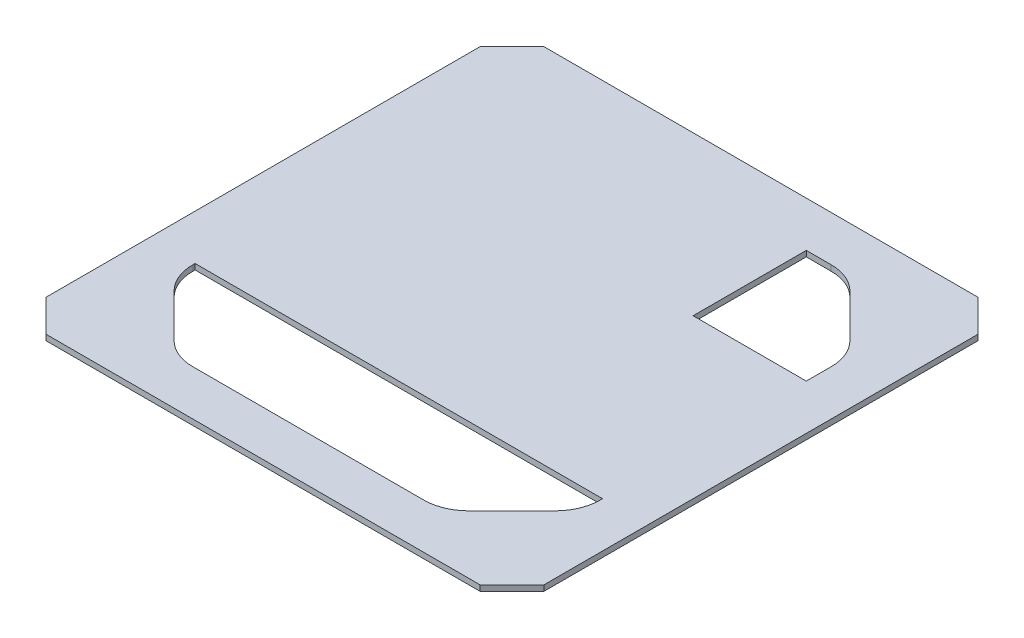
ISO-10303-21;
HEADER;
FILE_DESCRIPTION(('STEP AP214'),'2;1');
FILE_NAME('part.step','',(''),(''),'','','');
FILE_SCHEMA(('AUTOMOTIVE_DESIGN { 1 0 10303 214 1 1 1 1 }'));
ENDSEC;
DATA;
#1=APPLICATION_CONTEXT('core data for automotive mechanical design processes');
#2=APPLICATION_PROTOCOL_DEFINITION('international standard','automotive_design',2000,#1);
#3=PRODUCT_CONTEXT('',#1,'mechanical');
#4=PRODUCT('Part','Part','',(#3));
#5=PRODUCT_RELATED_PRODUCT_CATEGORY('part','',(#4));
#6=PRODUCT_DEFINITION_FORMATION('','',#4);
#7=PRODUCT_DEFINITION_CONTEXT('part definition',#1,'design');
#8=PRODUCT_DEFINITION('design','',#6,#7);
#9=PRODUCT_DEFINITION_SHAPE('','',#8);
#10=(LENGTH_UNIT() NAMED_UNIT(*) SI_UNIT(.MILLI.,.METRE.));
#11=(NAMED_UNIT(*) PLANE_ANGLE_UNIT() SI_UNIT($,.RADIAN.));
#12=(NAMED_UNIT(*) SI_UNIT($,.STERADIAN.) SOLID_ANGLE_UNIT());
#13=UNCERTAINTY_MEASURE_WITH_UNIT(LENGTH_MEASURE(1.E-05),#10,'distance_accuracy_value','');
#14=(GEOMETRIC_REPRESENTATION_CONTEXT(3) GLOBAL_UNCERTAINTY_ASSIGNED_CONTEXT((#13)) GLOBAL_UNIT_ASSIGNED_CONTEXT((#10,
#11,#12)) REPRESENTATION_CONTEXT('',''));
#15=CARTESIAN_POINT('',(0.,0.,0.));
#16=DIRECTION('',(0.,0.,1.));
#17=DIRECTION('',(1.,0.,0.));
#18=AXIS2_PLACEMENT_3D('',#15,#16,#17);
#19=CARTESIAN_POINT('',(114.3,0.,-27.0780936501646));
#20=DIRECTION('',(1.,0.,0.));
#21=DIRECTION('',(0.,0.,-1.));
#22=AXIS2_PLACEMENT_3D('',#19,#20,#21);
#23=PLANE('',#22);
#24=DIRECTION('',(0.,0.,-1.));
#25=VECTOR('',#24,1.);
#26=CARTESIAN_POINT('',(114.3,0.,-27.0780936501646));
#27=LINE('',#26,#25);
#28=CARTESIAN_POINT('',(114.3,0.,-2.58065486085614));
#29=VERTEX_POINT('',#28);
#30=CARTESIAN_POINT('',(114.3,0.,-16.557069165888));
#31=VERTEX_POINT('',#30);
#32=EDGE_CURVE('E242',#29,#31,#27,.T.);
#33=ORIENTED_EDGE('',*,*,#32,.F.);
#34=DIRECTION('',(0.,1.,0.));
#35=VECTOR('',#34,1.);
#36=CARTESIAN_POINT('',(114.3,0.,-2.58065486085614));
#37=LINE('',#36,#35);
#38=CARTESIAN_POINT('',(114.3,3.175,-2.58065486085614));
#39=VERTEX_POINT('',#38);
#40=EDGE_CURVE('E40',#29,#39,#37,.T.);
#41=ORIENTED_EDGE('',*,*,#40,.T.);
#42=DIRECTION('',(0.,0.,-1.));
#43=VECTOR('',#42,1.);
#44=CARTESIAN_POINT('',(114.3,3.175,-27.0780936501646));
#45=LINE('',#44,#43);
#46=CARTESIAN_POINT('',(114.3,3.175,-16.557069165888));
#47=VERTEX_POINT('',#46);
#48=EDGE_CURVE('E208',#39,#47,#45,.T.);
#49=ORIENTED_EDGE('',*,*,#48,.T.);
#50=DIRECTION('',(0.,1.,0.));
#51=VECTOR('',#50,1.);
#52=CARTESIAN_POINT('',(114.3,0.,-16.557069165888));
#53=LINE('',#52,#51);
#54=EDGE_CURVE('E323',#47,#31,#53,.F.);
#55=ORIENTED_EDGE('',*,*,#54,.T.);
#56=EDGE_LOOP('',(#33,#41,#49,#55));
#57=FACE_BOUND('',#56,.T.);
#58=ADVANCED_FACE('F32',(#57),#23,.F.);
#59=CARTESIAN_POINT('',(139.7,3.175,169.958832897006));
#60=DIRECTION('',(-0.707106781186548,0.,-0.707106781186547));
#61=DIRECTION('',(-0.707106781186547,0.,0.707106781186548));
#62=AXIS2_PLACEMENT_3D('',#59,#60,#61);
#63=PLANE('',#62);
#64=DIRECTION('',(0.707106781186547,0.,-0.707106781186548));
#65=VECTOR('',#64,1.);
#66=CARTESIAN_POINT('',(139.7,0.,169.958832897006));
#67=LINE('',#66,#65);
#68=CARTESIAN_POINT('',(121.739487757862,0.,187.919345139144));
#69=VERTEX_POINT('',#68);
#70=CARTESIAN_POINT('',(139.7,0.,169.958832897006));
#71=VERTEX_POINT('',#70);
#72=EDGE_CURVE('E248',#69,#71,#67,.T.);
#73=ORIENTED_EDGE('',*,*,#72,.T.);
#74=DIRECTION('',(0.,-1.,0.));
#75=VECTOR('',#74,1.);
#76=CARTESIAN_POINT('',(139.7,3.175,169.958832897006));
#77=LINE('',#76,#75);
#78=CARTESIAN_POINT('',(139.7,3.175,169.958832897006));
#79=VERTEX_POINT('',#78);
#80=EDGE_CURVE('E320',#79,#71,#77,.T.);
#81=ORIENTED_EDGE('',*,*,#80,.F.);
#82=DIRECTION('',(0.707106781186547,0.,-0.707106781186548));
#83=VECTOR('',#82,1.);
#84=CARTESIAN_POINT('',(139.7,3.175,169.958832897006));
#85=LINE('',#84,#83);
#86=CARTESIAN_POINT('',(121.739487757862,3.175,187.919345139144));
#87=VERTEX_POINT('',#86);
#88=EDGE_CURVE('E266',#87,#79,#85,.T.);
#89=ORIENTED_EDGE('',*,*,#88,.F.);
#90=DIRECTION('',(0.,-1.,0.));
#91=VECTOR('',#90,1.);
#92=CARTESIAN_POINT('',(121.739487757862,3.175,187.919345139144));
#93=LINE('',#92,#91);
#94=EDGE_CURVE('E284',#87,#69,#93,.T.);
#95=ORIENTED_EDGE('',*,*,#94,.T.);
#96=EDGE_LOOP('',(#73,#81,#89,#95));
#97=FACE_BOUND('',#96,.T.);
#98=ADVANCED_FACE('F461',(#97),#63,.F.);
#99=CARTESIAN_POINT('',(139.7,3.175,-73.5201426187178));
#100=DIRECTION('',(-1.,0.,0.));
#101=DIRECTION('',(0.,0.,1.));
#102=AXIS2_PLACEMENT_3D('',#99,#100,#101);
#103=PLANE('',#102);
#104=DIRECTION('',(0.,0.,-1.));
#105=VECTOR('',#104,1.);
#106=CARTESIAN_POINT('',(139.7,0.,-73.5201426187178));
#107=LINE('',#106,#105);
#108=CARTESIAN_POINT('',(139.7,0.,-73.5201426187178));
#109=VERTEX_POINT('',#108);
#110=EDGE_CURVE('E287',#71,#109,#107,.T.);
#111=ORIENTED_EDGE('',*,*,#110,.T.);
#112=DIRECTION('',(0.,-1.,0.));
#113=VECTOR('',#112,1.);
#114=CARTESIAN_POINT('',(139.7,3.175,-73.5201426187178));
#115=LINE('',#114,#113);
#116=CARTESIAN_POINT('',(139.7,3.175,-73.5201426187178));
#117=VERTEX_POINT('',#116);
#118=EDGE_CURVE('E317',#117,#109,#115,.T.);
#119=ORIENTED_EDGE('',*,*,#118,.F.);
#120=DIRECTION('',(0.,0.,-1.));
#121=VECTOR('',#120,1.);
#122=CARTESIAN_POINT('',(139.7,3.175,-73.5201426187178));
#123=LINE('',#122,#121);
#124=EDGE_CURVE('E269',#79,#117,#123,.T.);
#125=ORIENTED_EDGE('',*,*,#124,.F.);
#126=ORIENTED_EDGE('',*,*,#80,.T.);
#127=EDGE_LOOP('',(#111,#119,#125,#126));
#128=FACE_BOUND('',#127,.T.);
#129=ADVANCED_FACE('F466',(#128),#103,.F.);
#130=CARTESIAN_POINT('',(139.7,3.175,-73.5201426187178));
#131=DIRECTION('',(-0.707106781186548,0.,0.707106781186547));
#132=DIRECTION('',(0.707106781186547,0.,0.707106781186548));
#133=AXIS2_PLACEMENT_3D('',#130,#131,#132);
#134=PLANE('',#133);
#135=DIRECTION('',(-0.707106781186547,0.,-0.707106781186548));
#136=VECTOR('',#135,1.);
#137=CARTESIAN_POINT('',(139.7,0.,-73.5201426187178));
#138=LINE('',#137,#136);
#139=CARTESIAN_POINT('',(121.739487757862,0.,-91.4806548608561));
#140=VERTEX_POINT('',#139);
#141=EDGE_CURVE('E289',#109,#140,#138,.T.);
#142=ORIENTED_EDGE('',*,*,#141,.T.);
#143=DIRECTION('',(0.,-1.,0.));
#144=VECTOR('',#143,1.);
#145=CARTESIAN_POINT('',(121.739487757862,3.175,-91.4806548608561));
#146=LINE('',#145,#144);
#147=CARTESIAN_POINT('',(121.739487757862,3.175,-91.4806548608561));
#148=VERTEX_POINT('',#147);
#149=EDGE_CURVE('E314',#148,#140,#146,.T.);
#150=ORIENTED_EDGE('',*,*,#149,.F.);
#151=DIRECTION('',(-0.707106781186547,0.,-0.707106781186548));
#152=VECTOR('',#151,1.);
#153=CARTESIAN_POINT('',(139.7,3.175,-73.5201426187178));
#154=LINE('',#153,#152);
#155=EDGE_CURVE('E272',#117,#148,#154,.T.);
#156=ORIENTED_EDGE('',*,*,#155,.F.);
#157=ORIENTED_EDGE('',*,*,#118,.T.);
#158=EDGE_LOOP('',(#142,#150,#156,#157));
#159=FACE_BOUND('',#158,.T.);
#160=ADVANCED_FACE('F503',(#159),#134,.F.);
#161=CARTESIAN_POINT('',(-121.739487757862,3.175,-91.4806548608561));
#162=DIRECTION('',(0.,0.,1.));
#163=DIRECTION('',(1.,0.,0.));
#164=AXIS2_PLACEMENT_3D('',#161,#162,#163);
#165=PLANE('',#164);
#166=DIRECTION('',(-1.,0.,0.));
#167=VECTOR('',#166,1.);
#168=CARTESIAN_POINT('',(-121.739487757862,0.,-91.4806548608561));
#169=LINE('',#168,#167);
#170=CARTESIAN_POINT('',(-121.739487757862,0.,-91.4806548608561));
#171=VERTEX_POINT('',#170);
#172=EDGE_CURVE('E291',#140,#171,#169,.T.);
#173=ORIENTED_EDGE('',*,*,#172,.T.);
#174=DIRECTION('',(0.,-1.,0.));
#175=VECTOR('',#174,1.);
#176=CARTESIAN_POINT('',(-121.739487757862,3.175,-91.4806548608561));
#177=LINE('',#176,#175);
#178=CARTESIAN_POINT('',(-121.739487757862,3.175,-91.4806548608561));
#179=VERTEX_POINT('',#178);
#180=EDGE_CURVE('E311',#179,#171,#177,.T.);
#181=ORIENTED_EDGE('',*,*,#180,.F.);
#182=DIRECTION('',(-1.,0.,0.));
#183=VECTOR('',#182,1.);
#184=CARTESIAN_POINT('',(-121.739487757862,3.175,-91.4806548608561));
#185=LINE('',#184,#183);
#186=EDGE_CURVE('E274',#148,#179,#185,.T.);
#187=ORIENTED_EDGE('',*,*,#186,.F.);
#188=ORIENTED_EDGE('',*,*,#149,.T.);
#189=EDGE_LOOP('',(#173,#181,#187,#188));
#190=FACE_BOUND('',#189,.T.);
#191=ADVANCED_FACE('F507',(#190),#165,.F.);
#192=CARTESIAN_POINT('',(-139.7,3.175,-73.5201426187178));
#193=DIRECTION('',(0.707106781186547,0.,0.707106781186548));
#194=DIRECTION('',(0.707106781186548,0.,-0.707106781186547));
#195=AXIS2_PLACEMENT_3D('',#192,#193,#194);
#196=PLANE('',#195);
#197=DIRECTION('',(-0.707106781186548,0.,0.707106781186547));
#198=VECTOR('',#197,1.);
#199=CARTESIAN_POINT('',(-139.7,0.,-73.5201426187178));
#200=LINE('',#199,#198);
#201=CARTESIAN_POINT('',(-139.7,0.,-73.5201426187178));
#202=VERTEX_POINT('',#201);
#203=EDGE_CURVE('E293',#171,#202,#200,.T.);
#204=ORIENTED_EDGE('',*,*,#203,.T.);
#205=DIRECTION('',(0.,-1.,0.));
#206=VECTOR('',#205,1.);
#207=CARTESIAN_POINT('',(-139.7,3.175,-73.5201426187178));
#208=LINE('',#207,#206);
#209=CARTESIAN_POINT('',(-139.7,3.175,-73.5201426187178));
#210=VERTEX_POINT('',#209);
#211=EDGE_CURVE('E308',#210,#202,#208,.T.);
#212=ORIENTED_EDGE('',*,*,#211,.F.);
#213=DIRECTION('',(-0.707106781186548,0.,0.707106781186547));
#214=VECTOR('',#213,1.);
#215=CARTESIAN_POINT('',(-139.7,3.175,-73.5201426187178));
#216=LINE('',#215,#214);
#217=EDGE_CURVE('E276',#179,#210,#216,.T.);
#218=ORIENTED_EDGE('',*,*,#217,.F.);
#219=ORIENTED_EDGE('',*,*,#180,.T.);
#220=EDGE_LOOP('',(#204,#212,#218,#219));
#221=FACE_BOUND('',#220,.T.);
#222=ADVANCED_FACE('F511',(#221),#196,.F.);
#223=CARTESIAN_POINT('',(-139.7,3.175,-73.5201426187178));
#224=DIRECTION('',(1.,0.,0.));
#225=DIRECTION('',(0.,0.,-1.));
#226=AXIS2_PLACEMENT_3D('',#223,#224,#225);
#227=PLANE('',#226);
#228=DIRECTION('',(0.,-1.,0.));
#229=VECTOR('',#228,1.);
#230=CARTESIAN_POINT('',(-139.7,3.175,169.958832897006));
#231=LINE('',#230,#229);
#232=CARTESIAN_POINT('',(-139.7,3.175,169.958832897006));
#233=VERTEX_POINT('',#232);
#234=CARTESIAN_POINT('',(-139.7,0.,169.958832897006));
#235=VERTEX_POINT('',#234);
#236=EDGE_CURVE('E305',#233,#235,#231,.T.);
#237=ORIENTED_EDGE('',*,*,#236,.F.);
#238=DIRECTION('',(0.,0.,1.));
#239=VECTOR('',#238,1.);
#240=CARTESIAN_POINT('',(-139.7,3.175,-73.5201426187178));
#241=LINE('',#240,#239);
#242=EDGE_CURVE('E278',#210,#233,#241,.T.);
#243=ORIENTED_EDGE('',*,*,#242,.F.);
#244=ORIENTED_EDGE('',*,*,#211,.T.);
#245=DIRECTION('',(0.,0.,1.));
#246=VECTOR('',#245,1.);
#247=CARTESIAN_POINT('',(-139.7,0.,-73.5201426187178));
#248=LINE('',#247,#246);
#249=EDGE_CURVE('E295',#202,#235,#248,.T.);
#250=ORIENTED_EDGE('',*,*,#249,.T.);
#251=EDGE_LOOP('',(#237,#243,#244,#250));
#252=FACE_BOUND('',#251,.T.);
#253=ADVANCED_FACE('F515',(#252),#227,.F.);
#254=CARTESIAN_POINT('',(-139.7,3.175,169.958832897006));
#255=DIRECTION('',(0.707106781186547,0.,-0.707106781186548));
#256=DIRECTION('',(-0.707106781186548,0.,-0.707106781186547));
#257=AXIS2_PLACEMENT_3D('',#254,#255,#256);
#258=PLANE('',#257);
#259=DIRECTION('',(0.707106781186548,0.,0.707106781186547));
#260=VECTOR('',#259,1.);
#261=CARTESIAN_POINT('',(-139.7,0.,169.958832897006));
#262=LINE('',#261,#260);
#263=CARTESIAN_POINT('',(-121.739487757862,0.,187.919345139144));
#264=VERTEX_POINT('',#263);
#265=EDGE_CURVE('E297',#235,#264,#262,.T.);
#266=ORIENTED_EDGE('',*,*,#265,.T.);
#267=DIRECTION('',(0.,-1.,0.));
#268=VECTOR('',#267,1.);
#269=CARTESIAN_POINT('',(-121.739487757862,3.175,187.919345139144));
#270=LINE('',#269,#268);
#271=CARTESIAN_POINT('',(-121.739487757862,3.175,187.919345139144));
#272=VERTEX_POINT('',#271);
#273=EDGE_CURVE('E302',#272,#264,#270,.T.);
#274=ORIENTED_EDGE('',*,*,#273,.F.);
#275=DIRECTION('',(0.707106781186548,0.,0.707106781186547));
#276=VECTOR('',#275,1.);
#277=CARTESIAN_POINT('',(-139.7,3.175,169.958832897006));
#278=LINE('',#277,#276);
#279=EDGE_CURVE('E280',#233,#272,#278,.T.);
#280=ORIENTED_EDGE('',*,*,#279,.F.);
#281=ORIENTED_EDGE('',*,*,#236,.T.);
#282=EDGE_LOOP('',(#266,#274,#280,#281));
#283=FACE_BOUND('',#282,.T.);
#284=ADVANCED_FACE('F519',(#283),#258,.F.);
#285=CARTESIAN_POINT('',(-121.739487757862,3.175,187.919345139144));
#286=DIRECTION('',(0.,0.,-1.));
#287=DIRECTION('',(-1.,0.,0.));
#288=AXIS2_PLACEMENT_3D('',#285,#286,#287);
#289=PLANE('',#288);
#290=DIRECTION('',(1.,0.,0.));
#291=VECTOR('',#290,1.);
#292=CARTESIAN_POINT('',(-121.739487757862,0.,187.919345139144));
#293=LINE('',#292,#291);
#294=EDGE_CURVE('E270',#264,#69,#293,.T.);
#295=ORIENTED_EDGE('',*,*,#294,.T.);
#296=ORIENTED_EDGE('',*,*,#94,.F.);
#297=DIRECTION('',(1.,0.,0.));
#298=VECTOR('',#297,1.);
#299=CARTESIAN_POINT('',(-121.739487757862,3.175,187.919345139144));
#300=LINE('',#299,#298);
#301=EDGE_CURVE('E282',#272,#87,#300,.T.);
#302=ORIENTED_EDGE('',*,*,#301,.F.);
#303=ORIENTED_EDGE('',*,*,#273,.T.);
#304=EDGE_LOOP('',(#295,#296,#302,#303));
#305=FACE_BOUND('',#304,.T.);
#306=ADVANCED_FACE('F455',(#305),#289,.F.);
#307=CARTESIAN_POINT('',(0.,3.175,0.));
#308=DIRECTION('',(0.,1.,0.));
#309=DIRECTION('',(0.,0.,1.));
#310=AXIS2_PLACEMENT_3D('',#307,#308,#309);
#311=PLANE('',#310);
#312=ORIENTED_EDGE('',*,*,#217,.T.);
#313=ORIENTED_EDGE('',*,*,#242,.T.);
#314=ORIENTED_EDGE('',*,*,#279,.T.);
#315=ORIENTED_EDGE('',*,*,#301,.T.);
#316=ORIENTED_EDGE('',*,*,#88,.T.);
#317=ORIENTED_EDGE('',*,*,#124,.T.);
#318=ORIENTED_EDGE('',*,*,#155,.T.);
#319=ORIENTED_EDGE('',*,*,#186,.T.);
#320=EDGE_LOOP('',(#312,#313,#314,#315,#316,#317,#318,#319));
#321=FACE_BOUND('',#320,.T.);
#322=DIRECTION('',(0.,0.,1.));
#323=VECTOR('',#322,1.);
#324=CARTESIAN_POINT('',(-114.3,3.175,-27.0780936501646));
#325=LINE('',#324,#323);
#326=CARTESIAN_POINT('',(-114.3,3.175,111.719345139144));
#327=VERTEX_POINT('',#326);
#328=CARTESIAN_POINT('',(-114.3,3.175,112.995759444176));
#329=VERTEX_POINT('',#328);
#330=EDGE_CURVE('E250',#327,#329,#325,.T.);
#331=ORIENTED_EDGE('',*,*,#330,.F.);
#332=DIRECTION('',(1.,0.,0.));
#333=VECTOR('',#332,1.);
#334=CARTESIAN_POINT('',(-139.7,3.175,111.719345139144));
#335=LINE('',#334,#333);
#336=CARTESIAN_POINT('',(114.3,3.175,111.719345139144));
#337=VERTEX_POINT('',#336);
#338=EDGE_CURVE('E211',#327,#337,#335,.T.);
#339=ORIENTED_EDGE('',*,*,#338,.T.);
#340=CARTESIAN_POINT('',(114.3,3.175,112.995759444176));
#341=VERTEX_POINT('',#340);
#342=EDGE_CURVE('E261',#341,#337,#45,.T.);
#343=ORIENTED_EDGE('',*,*,#342,.F.);
#344=CARTESIAN_POINT('',(88.9000000000001,3.175,112.995759444176));
#345=DIRECTION('',(0.,1.,0.));
#346=DIRECTION('',(0.,0.,1.));
#347=AXIS2_PLACEMENT_3D('',#344,#345,#346);
#348=CIRCLE('',#347,25.4);
#349=CARTESIAN_POINT('',(106.860512242138,3.175,130.956271686314));
#350=VERTEX_POINT('',#349);
#351=EDGE_CURVE('E355',#341,#350,#348,.F.);
#352=ORIENTED_EDGE('',*,*,#351,.T.);
#353=DIRECTION('',(0.707106781186547,0.,-0.707106781186548));
#354=VECTOR('',#353,1.);
#355=CARTESIAN_POINT('',(103.778975515723,3.175,134.037808412729));
#356=LINE('',#355,#354);
#357=CARTESIAN_POINT('',(82.7369265471703,3.175,155.079857381282));
#358=VERTEX_POINT('',#357);
#359=EDGE_CURVE('E258',#358,#350,#356,.T.);
#360=ORIENTED_EDGE('',*,*,#359,.F.);
#361=CARTESIAN_POINT('',(64.776414305032,3.175,137.119345139144));
#362=DIRECTION('',(0.,1.,0.));
#363=DIRECTION('',(0.,0.,1.));
#364=AXIS2_PLACEMENT_3D('',#361,#362,#363);
#365=CIRCLE('',#364,25.4);
#366=CARTESIAN_POINT('',(64.776414305032,3.175,162.519345139144));
#367=VERTEX_POINT('',#366);
#368=EDGE_CURVE('E359',#358,#367,#365,.F.);
#369=ORIENTED_EDGE('',*,*,#368,.T.);
#370=DIRECTION('',(1.,0.,0.));
#371=VECTOR('',#370,1.);
#372=CARTESIAN_POINT('',(-75.2974387893084,3.175,162.519345139144));
#373=LINE('',#372,#371);
#374=CARTESIAN_POINT('',(-64.7764143050318,3.175,162.519345139144));
#375=VERTEX_POINT('',#374);
#376=EDGE_CURVE('E255',#375,#367,#373,.T.);
#377=ORIENTED_EDGE('',*,*,#376,.F.);
#378=CARTESIAN_POINT('',(-64.7764143050318,3.175,137.119345139144));
#379=DIRECTION('',(0.,1.,0.));
#380=DIRECTION('',(0.,0.,1.));
#381=AXIS2_PLACEMENT_3D('',#378,#379,#380);
#382=CIRCLE('',#381,25.4);
#383=CARTESIAN_POINT('',(-82.7369265471701,3.175,155.079857381282));
#384=VERTEX_POINT('',#383);
#385=EDGE_CURVE('E363',#375,#384,#382,.F.);
#386=ORIENTED_EDGE('',*,*,#385,.T.);
#387=DIRECTION('',(0.707106781186548,0.,0.707106781186547));
#388=VECTOR('',#387,1.);
#389=CARTESIAN_POINT('',(-85.818463273585,3.175,151.998320654867));
#390=LINE('',#389,#388);
#391=CARTESIAN_POINT('',(-106.860512242138,3.175,130.956271686314));
#392=VERTEX_POINT('',#391);
#393=EDGE_CURVE('E252',#392,#384,#390,.T.);
#394=ORIENTED_EDGE('',*,*,#393,.F.);
#395=CARTESIAN_POINT('',(-88.9,3.175,112.995759444176));
#396=DIRECTION('',(0.,1.,0.));
#397=DIRECTION('',(0.,0.,1.));
#398=AXIS2_PLACEMENT_3D('',#395,#396,#397);
#399=CIRCLE('',#398,25.4);
#400=EDGE_CURVE('E367',#392,#329,#399,.F.);
#401=ORIENTED_EDGE('',*,*,#400,.T.);
#402=EDGE_LOOP('',(#331,#339,#343,#352,#360,#369,#377,#386,#394,#401));
#403=FACE_BOUND('',#402,.T.);
#404=DIRECTION('',(0.,0.,-1.));
#405=VECTOR('',#404,1.);
#406=CARTESIAN_POINT('',(50.8,3.175,-2.58065486085614));
#407=LINE('',#406,#405);
#408=CARTESIAN_POINT('',(50.8,3.175,-2.58065486085614));
#409=VERTEX_POINT('',#408);
#410=CARTESIAN_POINT('',(50.8,3.175,-66.0806548608562));
#411=VERTEX_POINT('',#410);
#412=EDGE_CURVE('E205',#409,#411,#407,.T.);
#413=ORIENTED_EDGE('',*,*,#412,.T.);
#414=DIRECTION('',(-1.,0.,0.));
#415=VECTOR('',#414,1.);
#416=CARTESIAN_POINT('',(-75.2974387893084,3.175,-66.0806548608562));
#417=LINE('',#416,#415);
#418=CARTESIAN_POINT('',(64.7764143050318,3.175,-66.0806548608562));
#419=VERTEX_POINT('',#418);
#420=EDGE_CURVE('E226',#419,#411,#417,.T.);
#421=ORIENTED_EDGE('',*,*,#420,.F.);
#422=CARTESIAN_POINT('',(64.7764143050318,3.175,-40.6806548608562));
#423=DIRECTION('',(0.,1.,0.));
#424=DIRECTION('',(0.,0.,1.));
#425=AXIS2_PLACEMENT_3D('',#422,#423,#424);
#426=CIRCLE('',#425,25.4);
#427=CARTESIAN_POINT('',(82.7369265471701,3.175,-58.6411671029945));
#428=VERTEX_POINT('',#427);
#429=EDGE_CURVE('E376',#419,#428,#426,.F.);
#430=ORIENTED_EDGE('',*,*,#429,.T.);
#431=DIRECTION('',(-0.707106781186548,0.,-0.707106781186547));
#432=VECTOR('',#431,1.);
#433=CARTESIAN_POINT('',(85.8184632735851,3.175,-55.5596303765795));
#434=LINE('',#433,#432);
#435=CARTESIAN_POINT('',(106.860512242138,3.175,-34.5175814080263));
#436=VERTEX_POINT('',#435);
#437=EDGE_CURVE('E231',#436,#428,#434,.T.);
#438=ORIENTED_EDGE('',*,*,#437,.F.);
#439=CARTESIAN_POINT('',(88.9000000000001,3.175,-16.557069165888));
#440=DIRECTION('',(0.,1.,0.));
#441=DIRECTION('',(0.,0.,1.));
#442=AXIS2_PLACEMENT_3D('',#439,#440,#441);
#443=CIRCLE('',#442,25.4);
#444=EDGE_CURVE('E372',#436,#47,#443,.F.);
#445=ORIENTED_EDGE('',*,*,#444,.T.);
#446=ORIENTED_EDGE('',*,*,#48,.F.);
#447=DIRECTION('',(-1.,0.,0.));
#448=VECTOR('',#447,1.);
#449=CARTESIAN_POINT('',(50.8,3.175,-2.58065486085614));
#450=LINE('',#449,#448);
#451=EDGE_CURVE('E200',#39,#409,#450,.T.);
#452=ORIENTED_EDGE('',*,*,#451,.T.);
#453=EDGE_LOOP('',(#413,#421,#430,#438,#445,#446,#452));
#454=FACE_BOUND('',#453,.T.);
#455=ADVANCED_FACE('F202',(#321,#403,#454),#311,.T.);
#456=CARTESIAN_POINT('',(0.,0.,0.));
#457=DIRECTION('',(0.,1.,0.));
#458=DIRECTION('',(0.,0.,1.));
#459=AXIS2_PLACEMENT_3D('',#456,#457,#458);
#460=PLANE('',#459);
#461=ORIENTED_EDGE('',*,*,#249,.F.);
#462=ORIENTED_EDGE('',*,*,#203,.F.);
#463=ORIENTED_EDGE('',*,*,#172,.F.);
#464=ORIENTED_EDGE('',*,*,#141,.F.);
#465=ORIENTED_EDGE('',*,*,#110,.F.);
#466=ORIENTED_EDGE('',*,*,#72,.F.);
#467=ORIENTED_EDGE('',*,*,#294,.F.);
#468=ORIENTED_EDGE('',*,*,#265,.F.);
#469=EDGE_LOOP('',(#461,#462,#463,#464,#465,#466,#467,#468));
#470=FACE_BOUND('',#469,.T.);
#471=DIRECTION('',(-1.,0.,0.));
#472=VECTOR('',#471,1.);
#473=CARTESIAN_POINT('',(-139.7,0.,111.719345139144));
#474=LINE('',#473,#472);
#475=CARTESIAN_POINT('',(114.3,0.,111.719345139144));
#476=VERTEX_POINT('',#475);
#477=CARTESIAN_POINT('',(-114.3,0.,111.719345139144));
#478=VERTEX_POINT('',#477);
#479=EDGE_CURVE('E217',#476,#478,#474,.T.);
#480=ORIENTED_EDGE('',*,*,#479,.T.);
#481=DIRECTION('',(0.,0.,1.));
#482=VECTOR('',#481,1.);
#483=CARTESIAN_POINT('',(-114.3,0.,-27.0780936501646));
#484=LINE('',#483,#482);
#485=CARTESIAN_POINT('',(-114.3,0.,112.995759444176));
#486=VERTEX_POINT('',#485);
#487=EDGE_CURVE('E230',#478,#486,#484,.T.);
#488=ORIENTED_EDGE('',*,*,#487,.T.);
#489=CARTESIAN_POINT('',(-88.9,0.,112.995759444176));
#490=DIRECTION('',(0.,1.,0.));
#491=DIRECTION('',(0.,0.,1.));
#492=AXIS2_PLACEMENT_3D('',#489,#490,#491);
#493=CIRCLE('',#492,25.4);
#494=CARTESIAN_POINT('',(-106.860512242138,0.,130.956271686314));
#495=VERTEX_POINT('',#494);
#496=EDGE_CURVE('E370',#486,#495,#493,.T.);
#497=ORIENTED_EDGE('',*,*,#496,.T.);
#498=DIRECTION('',(0.707106781186547,0.,0.707106781186548));
#499=VECTOR('',#498,1.);
#500=CARTESIAN_POINT('',(-103.778975515723,0.,134.037808412729));
#501=LINE('',#500,#499);
#502=CARTESIAN_POINT('',(-82.7369265471702,0.,155.079857381282));
#503=VERTEX_POINT('',#502);
#504=EDGE_CURVE('E233',#495,#503,#501,.T.);
#505=ORIENTED_EDGE('',*,*,#504,.T.);
#506=CARTESIAN_POINT('',(-64.7764143050318,0.,137.119345139144));
#507=DIRECTION('',(0.,1.,0.));
#508=DIRECTION('',(0.,0.,1.));
#509=AXIS2_PLACEMENT_3D('',#506,#507,#508);
#510=CIRCLE('',#509,25.4);
#511=CARTESIAN_POINT('',(-64.7764143050318,0.,162.519345139144));
#512=VERTEX_POINT('',#511);
#513=EDGE_CURVE('E365',#503,#512,#510,.T.);
#514=ORIENTED_EDGE('',*,*,#513,.T.);
#515=DIRECTION('',(1.,0.,0.));
#516=VECTOR('',#515,1.);
#517=CARTESIAN_POINT('',(-75.2974387893084,0.,162.519345139144));
#518=LINE('',#517,#516);
#519=CARTESIAN_POINT('',(64.776414305032,0.,162.519345139144));
#520=VERTEX_POINT('',#519);
#521=EDGE_CURVE('E236',#512,#520,#518,.T.);
#522=ORIENTED_EDGE('',*,*,#521,.T.);
#523=CARTESIAN_POINT('',(64.776414305032,0.,137.119345139144));
#524=DIRECTION('',(0.,1.,0.));
#525=DIRECTION('',(0.,0.,1.));
#526=AXIS2_PLACEMENT_3D('',#523,#524,#525);
#527=CIRCLE('',#526,25.4);
#528=CARTESIAN_POINT('',(82.7369265471703,0.,155.079857381282));
#529=VERTEX_POINT('',#528);
#530=EDGE_CURVE('E361',#520,#529,#527,.T.);
#531=ORIENTED_EDGE('',*,*,#530,.T.);
#532=DIRECTION('',(0.707106781186548,0.,-0.707106781186547));
#533=VECTOR('',#532,1.);
#534=CARTESIAN_POINT('',(85.8184632735851,0.,151.998320654867));
#535=LINE('',#534,#533);
#536=CARTESIAN_POINT('',(106.860512242138,0.,130.956271686314));
#537=VERTEX_POINT('',#536);
#538=EDGE_CURVE('E239',#529,#537,#535,.T.);
#539=ORIENTED_EDGE('',*,*,#538,.T.);
#540=CARTESIAN_POINT('',(88.9000000000001,0.,112.995759444176));
#541=DIRECTION('',(0.,1.,0.));
#542=DIRECTION('',(0.,0.,1.));
#543=AXIS2_PLACEMENT_3D('',#540,#541,#542);
#544=CIRCLE('',#543,25.4);
#545=CARTESIAN_POINT('',(114.3,0.,112.995759444176));
#546=VERTEX_POINT('',#545);
#547=EDGE_CURVE('E357',#537,#546,#544,.T.);
#548=ORIENTED_EDGE('',*,*,#547,.T.);
#549=EDGE_CURVE('E243',#546,#476,#27,.T.);
#550=ORIENTED_EDGE('',*,*,#549,.T.);
#551=EDGE_LOOP('',(#480,#488,#497,#505,#514,#522,#531,#539,#548,#550));
#552=FACE_BOUND('',#551,.T.);
#553=DIRECTION('',(-1.,0.,0.));
#554=VECTOR('',#553,1.);
#555=CARTESIAN_POINT('',(-75.2974387893084,0.,-66.0806548608562));
#556=LINE('',#555,#554);
#557=CARTESIAN_POINT('',(64.7764143050318,0.,-66.0806548608562));
#558=VERTEX_POINT('',#557);
#559=CARTESIAN_POINT('',(50.8,0.,-66.0806548608562));
#560=VERTEX_POINT('',#559);
#561=EDGE_CURVE('E228',#558,#560,#556,.T.);
#562=ORIENTED_EDGE('',*,*,#561,.T.);
#563=DIRECTION('',(0.,0.,1.));
#564=VECTOR('',#563,1.);
#565=CARTESIAN_POINT('',(50.8,0.,-2.58065486085614));
#566=LINE('',#565,#564);
#567=CARTESIAN_POINT('',(50.8,0.,-2.58065486085614));
#568=VERTEX_POINT('',#567);
#569=EDGE_CURVE('E227',#560,#568,#566,.T.);
#570=ORIENTED_EDGE('',*,*,#569,.T.);
#571=DIRECTION('',(1.,0.,0.));
#572=VECTOR('',#571,1.);
#573=CARTESIAN_POINT('',(50.8,0.,-2.58065486085614));
#574=LINE('',#573,#572);
#575=EDGE_CURVE('E47',#568,#29,#574,.T.);
#576=ORIENTED_EDGE('',*,*,#575,.T.);
#577=ORIENTED_EDGE('',*,*,#32,.T.);
#578=CARTESIAN_POINT('',(88.9000000000001,0.,-16.557069165888));
#579=DIRECTION('',(0.,1.,0.));
#580=DIRECTION('',(0.,0.,1.));
#581=AXIS2_PLACEMENT_3D('',#578,#579,#580);
#582=CIRCLE('',#581,25.4);
#583=CARTESIAN_POINT('',(106.860512242138,0.,-34.5175814080263));
#584=VERTEX_POINT('',#583);
#585=EDGE_CURVE('E374',#31,#584,#582,.T.);
#586=ORIENTED_EDGE('',*,*,#585,.T.);
#587=DIRECTION('',(-0.707106781186547,0.,-0.707106781186548));
#588=VECTOR('',#587,1.);
#589=CARTESIAN_POINT('',(103.778975515723,0.,-37.5991181344412));
#590=LINE('',#589,#588);
#591=CARTESIAN_POINT('',(82.7369265471701,0.,-58.6411671029945));
#592=VERTEX_POINT('',#591);
#593=EDGE_CURVE('E246',#584,#592,#590,.T.);
#594=ORIENTED_EDGE('',*,*,#593,.T.);
#595=CARTESIAN_POINT('',(64.7764143050318,0.,-40.6806548608562));
#596=DIRECTION('',(0.,1.,0.));
#597=DIRECTION('',(0.,0.,1.));
#598=AXIS2_PLACEMENT_3D('',#595,#596,#597);
#599=CIRCLE('',#598,25.4);
#600=EDGE_CURVE('E54',#592,#558,#599,.T.);
#601=ORIENTED_EDGE('',*,*,#600,.T.);
#602=EDGE_LOOP('',(#562,#570,#576,#577,#586,#594,#601));
#603=FACE_BOUND('',#602,.T.);
#604=ADVANCED_FACE('F385',(#470,#552,#603),#460,.F.);
#605=CARTESIAN_POINT('',(-75.2974387893084,0.,-66.0806548608562));
#606=DIRECTION('',(0.,0.,-1.));
#607=DIRECTION('',(-1.,0.,0.));
#608=AXIS2_PLACEMENT_3D('',#605,#606,#607);
#609=PLANE('',#608);
#610=ORIENTED_EDGE('',*,*,#420,.T.);
#611=DIRECTION('',(0.,-1.,0.));
#612=VECTOR('',#611,1.);
#613=CARTESIAN_POINT('',(50.8,0.,-66.0806548608562));
#614=LINE('',#613,#612);
#615=EDGE_CURVE('E11',#411,#560,#614,.T.);
#616=ORIENTED_EDGE('',*,*,#615,.T.);
#617=ORIENTED_EDGE('',*,*,#561,.F.);
#618=DIRECTION('',(0.,1.,0.));
#619=VECTOR('',#618,1.);
#620=CARTESIAN_POINT('',(64.7764143050318,3.175,-66.0806548608562));
#621=LINE('',#620,#619);
#622=EDGE_CURVE('E352',#558,#419,#621,.T.);
#623=ORIENTED_EDGE('',*,*,#622,.T.);
#624=EDGE_LOOP('',(#610,#616,#617,#623));
#625=FACE_BOUND('',#624,.T.);
#626=ADVANCED_FACE('F397',(#625),#609,.F.);
#627=CARTESIAN_POINT('',(85.8184632735851,0.,-55.5596303765795));
#628=DIRECTION('',(0.707106781186547,0.,-0.707106781186548));
#629=DIRECTION('',(-0.707106781186548,0.,-0.707106781186547));
#630=AXIS2_PLACEMENT_3D('',#627,#628,#629);
#631=PLANE('',#630);
#632=ORIENTED_EDGE('',*,*,#593,.F.);
#633=DIRECTION('',(0.,1.,0.));
#634=VECTOR('',#633,1.);
#635=CARTESIAN_POINT('',(106.860512242138,3.175,-34.5175814080263));
#636=LINE('',#635,#634);
#637=EDGE_CURVE('E349',#584,#436,#636,.T.);
#638=ORIENTED_EDGE('',*,*,#637,.T.);
#639=ORIENTED_EDGE('',*,*,#437,.T.);
#640=DIRECTION('',(0.,1.,0.));
#641=VECTOR('',#640,1.);
#642=CARTESIAN_POINT('',(82.7369265471701,0.,-58.6411671029945));
#643=LINE('',#642,#641);
#644=EDGE_CURVE('E347',#428,#592,#643,.F.);
#645=ORIENTED_EDGE('',*,*,#644,.T.);
#646=EDGE_LOOP('',(#632,#638,#639,#645));
#647=FACE_BOUND('',#646,.T.);
#648=ADVANCED_FACE('F390',(#647),#631,.F.);
#649=ORIENTED_EDGE('',*,*,#342,.T.);
#650=DIRECTION('',(0.,-1.,0.));
#651=VECTOR('',#650,1.);
#652=CARTESIAN_POINT('',(114.3,0.,111.719345139144));
#653=LINE('',#652,#651);
#654=EDGE_CURVE('E223',#337,#476,#653,.T.);
#655=ORIENTED_EDGE('',*,*,#654,.T.);
#656=ORIENTED_EDGE('',*,*,#549,.F.);
#657=DIRECTION('',(0.,1.,0.));
#658=VECTOR('',#657,1.);
#659=CARTESIAN_POINT('',(114.3,3.175,112.995759444176));
#660=LINE('',#659,#658);
#661=EDGE_CURVE('E326',#546,#341,#660,.T.);
#662=ORIENTED_EDGE('',*,*,#661,.T.);
#663=EDGE_LOOP('',(#649,#655,#656,#662));
#664=FACE_BOUND('',#663,.T.);
#665=ADVANCED_FACE('F407',(#664),#23,.F.);
#666=CARTESIAN_POINT('',(103.778975515723,0.,134.037808412729));
#667=DIRECTION('',(0.707106781186548,0.,0.707106781186547));
#668=DIRECTION('',(0.707106781186547,0.,-0.707106781186548));
#669=AXIS2_PLACEMENT_3D('',#666,#667,#668);
#670=PLANE('',#669);
#671=ORIENTED_EDGE('',*,*,#359,.T.);
#672=DIRECTION('',(0.,1.,0.));
#673=VECTOR('',#672,1.);
#674=CARTESIAN_POINT('',(106.860512242138,0.,130.956271686314));
#675=LINE('',#674,#673);
#676=EDGE_CURVE('E332',#350,#537,#675,.F.);
#677=ORIENTED_EDGE('',*,*,#676,.T.);
#678=ORIENTED_EDGE('',*,*,#538,.F.);
#679=DIRECTION('',(0.,1.,0.));
#680=VECTOR('',#679,1.);
#681=CARTESIAN_POINT('',(82.7369265471703,3.175,155.079857381282));
#682=LINE('',#681,#680);
#683=EDGE_CURVE('E329',#529,#358,#682,.T.);
#684=ORIENTED_EDGE('',*,*,#683,.T.);
#685=EDGE_LOOP('',(#671,#677,#678,#684));
#686=FACE_BOUND('',#685,.T.);
#687=ADVANCED_FACE('F416',(#686),#670,.F.);
#688=CARTESIAN_POINT('',(-75.2974387893084,0.,162.519345139144));
#689=DIRECTION('',(0.,0.,1.));
#690=DIRECTION('',(1.,0.,0.));
#691=AXIS2_PLACEMENT_3D('',#688,#689,#690);
#692=PLANE('',#691);
#693=ORIENTED_EDGE('',*,*,#376,.T.);
#694=DIRECTION('',(0.,1.,0.));
#695=VECTOR('',#694,1.);
#696=CARTESIAN_POINT('',(64.776414305032,0.,162.519345139144));
#697=LINE('',#696,#695);
#698=EDGE_CURVE('E337',#367,#520,#697,.F.);
#699=ORIENTED_EDGE('',*,*,#698,.T.);
#700=ORIENTED_EDGE('',*,*,#521,.F.);
#701=DIRECTION('',(0.,1.,0.));
#702=VECTOR('',#701,1.);
#703=CARTESIAN_POINT('',(-64.7764143050318,3.175,162.519345139144));
#704=LINE('',#703,#702);
#705=EDGE_CURVE('E334',#512,#375,#704,.T.);
#706=ORIENTED_EDGE('',*,*,#705,.T.);
#707=EDGE_LOOP('',(#693,#699,#700,#706));
#708=FACE_BOUND('',#707,.T.);
#709=ADVANCED_FACE('F425',(#708),#692,.F.);
#710=CARTESIAN_POINT('',(-85.818463273585,0.,151.998320654867));
#711=DIRECTION('',(-0.707106781186547,0.,0.707106781186548));
#712=DIRECTION('',(0.707106781186548,0.,0.707106781186547));
#713=AXIS2_PLACEMENT_3D('',#710,#711,#712);
#714=PLANE('',#713);
#715=ORIENTED_EDGE('',*,*,#393,.T.);
#716=DIRECTION('',(0.,1.,0.));
#717=VECTOR('',#716,1.);
#718=CARTESIAN_POINT('',(-82.7369265471701,0.,155.079857381282));
#719=LINE('',#718,#717);
#720=EDGE_CURVE('E342',#384,#503,#719,.F.);
#721=ORIENTED_EDGE('',*,*,#720,.T.);
#722=ORIENTED_EDGE('',*,*,#504,.F.);
#723=DIRECTION('',(0.,1.,0.));
#724=VECTOR('',#723,1.);
#725=CARTESIAN_POINT('',(-106.860512242138,3.175,130.956271686314));
#726=LINE('',#725,#724);
#727=EDGE_CURVE('E339',#495,#392,#726,.T.);
#728=ORIENTED_EDGE('',*,*,#727,.T.);
#729=EDGE_LOOP('',(#715,#721,#722,#728));
#730=FACE_BOUND('',#729,.T.);
#731=ADVANCED_FACE('F434',(#730),#714,.F.);
#732=CARTESIAN_POINT('',(-114.3,0.,-27.0780936501646));
#733=DIRECTION('',(-1.,0.,0.));
#734=DIRECTION('',(0.,0.,1.));
#735=AXIS2_PLACEMENT_3D('',#732,#733,#734);
#736=PLANE('',#735);
#737=ORIENTED_EDGE('',*,*,#487,.F.);
#738=DIRECTION('',(0.,1.,0.));
#739=VECTOR('',#738,1.);
#740=CARTESIAN_POINT('',(-114.3,0.,111.719345139144));
#741=LINE('',#740,#739);
#742=EDGE_CURVE('E379',#478,#327,#741,.T.);
#743=ORIENTED_EDGE('',*,*,#742,.T.);
#744=ORIENTED_EDGE('',*,*,#330,.T.);
#745=DIRECTION('',(0.,1.,0.));
#746=VECTOR('',#745,1.);
#747=CARTESIAN_POINT('',(-114.3,0.,112.995759444176));
#748=LINE('',#747,#746);
#749=EDGE_CURVE('E344',#329,#486,#748,.F.);
#750=ORIENTED_EDGE('',*,*,#749,.T.);
#751=EDGE_LOOP('',(#737,#743,#744,#750));
#752=FACE_BOUND('',#751,.T.);
#753=ADVANCED_FACE('F443',(#752),#736,.F.);
#754=CARTESIAN_POINT('',(88.9000000000001,0.,112.995759444176));
#755=DIRECTION('',(0.,-1.,0.));
#756=DIRECTION('',(0.,0.,-1.));
#757=AXIS2_PLACEMENT_3D('',#754,#755,#756);
#758=CYLINDRICAL_SURFACE('',#757,25.4);
#759=ORIENTED_EDGE('',*,*,#547,.F.);
#760=ORIENTED_EDGE('',*,*,#676,.F.);
#761=ORIENTED_EDGE('',*,*,#351,.F.);
#762=ORIENTED_EDGE('',*,*,#661,.F.);
#763=EDGE_LOOP('',(#759,#760,#761,#762));
#764=FACE_BOUND('',#763,.T.);
#765=ADVANCED_FACE('F412',(#764),#758,.F.);
#766=CARTESIAN_POINT('',(64.776414305032,0.,137.119345139144));
#767=DIRECTION('',(0.,-1.,0.));
#768=DIRECTION('',(0.,0.,-1.));
#769=AXIS2_PLACEMENT_3D('',#766,#767,#768);
#770=CYLINDRICAL_SURFACE('',#769,25.4);
#771=ORIENTED_EDGE('',*,*,#530,.F.);
#772=ORIENTED_EDGE('',*,*,#698,.F.);
#773=ORIENTED_EDGE('',*,*,#368,.F.);
#774=ORIENTED_EDGE('',*,*,#683,.F.);
#775=EDGE_LOOP('',(#771,#772,#773,#774));
#776=FACE_BOUND('',#775,.T.);
#777=ADVANCED_FACE('F421',(#776),#770,.F.);
#778=CARTESIAN_POINT('',(-64.7764143050318,0.,137.119345139144));
#779=DIRECTION('',(0.,-1.,0.));
#780=DIRECTION('',(0.,0.,-1.));
#781=AXIS2_PLACEMENT_3D('',#778,#779,#780);
#782=CYLINDRICAL_SURFACE('',#781,25.4);
#783=ORIENTED_EDGE('',*,*,#513,.F.);
#784=ORIENTED_EDGE('',*,*,#720,.F.);
#785=ORIENTED_EDGE('',*,*,#385,.F.);
#786=ORIENTED_EDGE('',*,*,#705,.F.);
#787=EDGE_LOOP('',(#783,#784,#785,#786));
#788=FACE_BOUND('',#787,.T.);
#789=ADVANCED_FACE('F430',(#788),#782,.F.);
#790=CARTESIAN_POINT('',(-88.9,0.,112.995759444176));
#791=DIRECTION('',(0.,-1.,0.));
#792=DIRECTION('',(0.,0.,-1.));
#793=AXIS2_PLACEMENT_3D('',#790,#791,#792);
#794=CYLINDRICAL_SURFACE('',#793,25.4);
#795=ORIENTED_EDGE('',*,*,#496,.F.);
#796=ORIENTED_EDGE('',*,*,#749,.F.);
#797=ORIENTED_EDGE('',*,*,#400,.F.);
#798=ORIENTED_EDGE('',*,*,#727,.F.);
#799=EDGE_LOOP('',(#795,#796,#797,#798));
#800=FACE_BOUND('',#799,.T.);
#801=ADVANCED_FACE('F439',(#800),#794,.F.);
#802=CARTESIAN_POINT('',(88.9000000000001,0.,-16.557069165888));
#803=DIRECTION('',(0.,-1.,0.));
#804=DIRECTION('',(0.,0.,-1.));
#805=AXIS2_PLACEMENT_3D('',#802,#803,#804);
#806=CYLINDRICAL_SURFACE('',#805,25.4);
#807=ORIENTED_EDGE('',*,*,#585,.F.);
#808=ORIENTED_EDGE('',*,*,#54,.F.);
#809=ORIENTED_EDGE('',*,*,#444,.F.);
#810=ORIENTED_EDGE('',*,*,#637,.F.);
#811=EDGE_LOOP('',(#807,#808,#809,#810));
#812=FACE_BOUND('',#811,.T.);
#813=ADVANCED_FACE('F393',(#812),#806,.F.);
#814=CARTESIAN_POINT('',(64.7764143050318,0.,-40.6806548608562));
#815=DIRECTION('',(0.,-1.,0.));
#816=DIRECTION('',(0.,0.,-1.));
#817=AXIS2_PLACEMENT_3D('',#814,#815,#816);
#818=CYLINDRICAL_SURFACE('',#817,25.4);
#819=ORIENTED_EDGE('',*,*,#600,.F.);
#820=ORIENTED_EDGE('',*,*,#644,.F.);
#821=ORIENTED_EDGE('',*,*,#429,.F.);
#822=ORIENTED_EDGE('',*,*,#622,.F.);
#823=EDGE_LOOP('',(#819,#820,#821,#822));
#824=FACE_BOUND('',#823,.T.);
#825=ADVANCED_FACE('F34',(#824),#818,.F.);
#826=CARTESIAN_POINT('',(50.8,-335.22832193118,-2.58065486085614));
#827=DIRECTION('',(1.,0.,0.));
#828=DIRECTION('',(0.,0.,-1.));
#829=AXIS2_PLACEMENT_3D('',#826,#827,#828);
#830=PLANE('',#829);
#831=ORIENTED_EDGE('',*,*,#615,.F.);
#832=ORIENTED_EDGE('',*,*,#412,.F.);
#833=DIRECTION('',(0.,1.,0.));
#834=VECTOR('',#833,1.);
#835=CARTESIAN_POINT('',(50.8,-335.22832193118,-2.58065486085614));
#836=LINE('',#835,#834);
#837=EDGE_CURVE('E214',#568,#409,#836,.T.);
#838=ORIENTED_EDGE('',*,*,#837,.F.);
#839=ORIENTED_EDGE('',*,*,#569,.F.);
#840=EDGE_LOOP('',(#831,#832,#838,#839));
#841=FACE_BOUND('',#840,.T.);
#842=ADVANCED_FACE('F219',(#841),#830,.T.);
#843=CARTESIAN_POINT('',(50.8,-335.22832193118,-2.58065486085614));
#844=DIRECTION('',(0.,0.,-1.));
#845=DIRECTION('',(-1.,0.,0.));
#846=AXIS2_PLACEMENT_3D('',#843,#844,#845);
#847=PLANE('',#846);
#848=ORIENTED_EDGE('',*,*,#40,.F.);
#849=ORIENTED_EDGE('',*,*,#575,.F.);
#850=ORIENTED_EDGE('',*,*,#837,.T.);
#851=ORIENTED_EDGE('',*,*,#451,.F.);
#852=EDGE_LOOP('',(#848,#849,#850,#851));
#853=FACE_BOUND('',#852,.T.);
#854=ADVANCED_FACE('F215',(#853),#847,.T.);
#855=CARTESIAN_POINT('',(-139.7,-335.22832193118,111.719345139144));
#856=DIRECTION('',(0.,0.,1.));
#857=DIRECTION('',(1.,0.,0.));
#858=AXIS2_PLACEMENT_3D('',#855,#856,#857);
#859=PLANE('',#858);
#860=ORIENTED_EDGE('',*,*,#654,.F.);
#861=ORIENTED_EDGE('',*,*,#338,.F.);
#862=ORIENTED_EDGE('',*,*,#742,.F.);
#863=ORIENTED_EDGE('',*,*,#479,.F.);
#864=EDGE_LOOP('',(#860,#861,#862,#863));
#865=FACE_BOUND('',#864,.T.);
#866=ADVANCED_FACE('F445',(#865),#859,.T.);
#867=CLOSED_SHELL('',(#58,#98,#129,#160,#191,#222,#253,#284,#306,#455,#604,#626,#648,#665,#687,
#709,#731,#753,#765,#777,#789,#801,#813,#825,#842,#854,#866));
#868=MANIFOLD_SOLID_BREP('B2',#867);
#869=ADVANCED_BREP_SHAPE_REPRESENTATION('',(#18,#868),#14);
#870=SHAPE_DEFINITION_REPRESENTATION(#9,#869);
ENDSEC;
END-ISO-10303-21;
